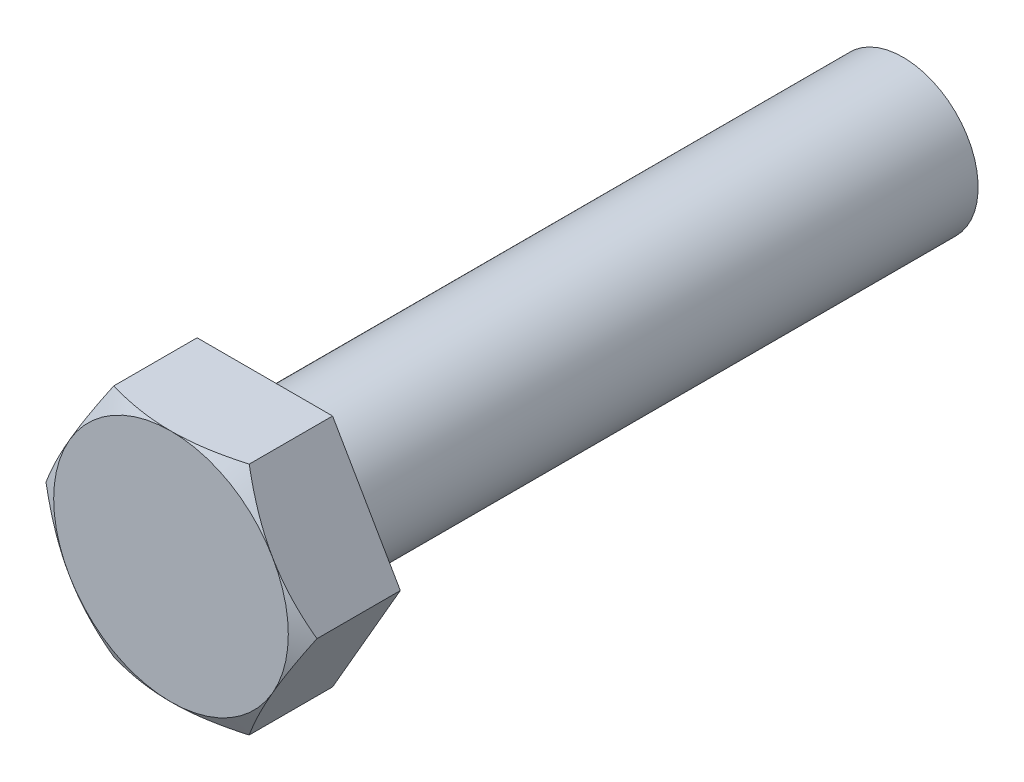
ISO-10303-21;
HEADER;
FILE_DESCRIPTION(('STEP AP214'),'2;1');
FILE_NAME('part.step','',(''),(''),'','','');
FILE_SCHEMA(('AUTOMOTIVE_DESIGN { 1 0 10303 214 1 1 1 1 }'));
ENDSEC;
DATA;
#1=APPLICATION_CONTEXT('core data for automotive mechanical design processes');
#2=APPLICATION_PROTOCOL_DEFINITION('international standard','automotive_design',2000,#1);
#3=PRODUCT_CONTEXT('',#1,'mechanical');
#4=PRODUCT('Part','Part','',(#3));
#5=PRODUCT_RELATED_PRODUCT_CATEGORY('part','',(#4));
#6=PRODUCT_DEFINITION_FORMATION('','',#4);
#7=PRODUCT_DEFINITION_CONTEXT('part definition',#1,'design');
#8=PRODUCT_DEFINITION('design','',#6,#7);
#9=PRODUCT_DEFINITION_SHAPE('','',#8);
#10=(LENGTH_UNIT() NAMED_UNIT(*) SI_UNIT(.MILLI.,.METRE.));
#11=(NAMED_UNIT(*) PLANE_ANGLE_UNIT() SI_UNIT($,.RADIAN.));
#12=(NAMED_UNIT(*) SI_UNIT($,.STERADIAN.) SOLID_ANGLE_UNIT());
#13=UNCERTAINTY_MEASURE_WITH_UNIT(LENGTH_MEASURE(1.E-05),#10,'distance_accuracy_value','');
#14=(GEOMETRIC_REPRESENTATION_CONTEXT(3) GLOBAL_UNCERTAINTY_ASSIGNED_CONTEXT((#13)) GLOBAL_UNIT_ASSIGNED_CONTEXT((#10,
#11,#12)) REPRESENTATION_CONTEXT('',''));
#15=CARTESIAN_POINT('',(0.,0.,0.));
#16=DIRECTION('',(0.,0.,1.));
#17=DIRECTION('',(1.,0.,0.));
#18=AXIS2_PLACEMENT_3D('',#15,#16,#17);
#19=CARTESIAN_POINT('',(7.21687836487047,-12.4999999999999,10.));
#20=DIRECTION('',(-0.866025403784442,0.499999999999995,0.));
#21=DIRECTION('',(-0.499999999999995,-0.866025403784442,0.));
#22=AXIS2_PLACEMENT_3D('',#19,#20,#21);
#23=PLANE('',#22);
#24=CARTESIAN_POINT('',(7.21676289481664,-12.5001999999999,8.88347836407033));
#25=CARTESIAN_POINT('',(7.37538720676169,-12.2254546323954,8.97505452339786));
#26=CARTESIAN_POINT('',(7.5346302388658,-11.9496376100398,9.06247516136614));
#27=CARTESIAN_POINT('',(7.85439324689781,-11.3957918337473,9.22785029648815));
#28=CARTESIAN_POINT('',(8.01491362441963,-11.1177623842294,9.3058016802497));
#29=CARTESIAN_POINT('',(8.33754155397065,-10.5589544183062,9.45119048700353));
#30=CARTESIAN_POINT('',(8.49965192926075,-10.2781710118697,9.518603033399));
#31=CARTESIAN_POINT('',(8.82499915663676,-9.7146530839528,9.64146662159211));
#32=CARTESIAN_POINT('',(8.98823594390972,-9.43191867473171,9.69691834578115));
#33=CARTESIAN_POINT('',(9.31165322870549,-8.87174350541945,9.79350173205532));
#34=CARTESIAN_POINT('',(9.47180971512837,-8.59434433377332,9.83495306623975));
#35=CARTESIAN_POINT('',(9.79285656486179,-8.03827487842509,9.90445793985327));
#36=CARTESIAN_POINT('',(9.95374694223766,-7.75960457036115,9.93251122140473));
#37=CARTESIAN_POINT('',(10.2757979783547,-7.20179581317628,9.97451166013347));
#38=CARTESIAN_POINT('',(10.4369580868775,-6.92265831706135,9.98847557991421));
#39=CARTESIAN_POINT('',(10.7594270802745,-6.36412563663214,10.0019969897623));
#40=CARTESIAN_POINT('',(10.9207359603978,-6.08473046054667,10.0015549249595));
#41=CARTESIAN_POINT('',(11.2223029665878,-5.56240108393915,9.98727051925018));
#42=CARTESIAN_POINT('',(11.362582581157,-5.319429664239,9.97517053237145));
#43=CARTESIAN_POINT('',(11.642819136161,-4.8340457128341,9.9403038103469));
#44=CARTESIAN_POINT('',(11.7827760530676,-4.59163322188117,9.91753632069194));
#45=CARTESIAN_POINT('',(12.0622911922356,-4.10749879935742,9.86173156560461));
#46=CARTESIAN_POINT('',(12.2018489887703,-3.86577760516695,9.82868581800106));
#47=CARTESIAN_POINT('',(12.4803103038966,-3.38346845942574,9.75290433749104));
#48=CARTESIAN_POINT('',(12.6192137773526,-3.14288058605226,9.71016794582642));
#49=CARTESIAN_POINT('',(13.0408630466772,-2.41256262860773,9.56634247770933));
#50=CARTESIAN_POINT('',(13.3223878040513,-1.92494744524722,9.45091239645998));
#51=CARTESIAN_POINT('',(13.8812393974114,-0.956988091656618,9.18893319969106));
#52=CARTESIAN_POINT('',(14.1585733887867,-0.476631527928806,9.04244561244873));
#53=CARTESIAN_POINT('',(14.4338721997945,0.000200000000000119,8.88347836407033));
#54=B_SPLINE_CURVE_WITH_KNOTS('',3,(#24,#25,#26,#27,#28,#29,#30,#31,#32,#33,#34,#35,#36,#37,#38,
#39,#40,#41,#42,#43,#44,#45,#46,#47,#48,#49,#50,#51,#52,#53),.UNSPECIFIED.,.F.,.F.,(4,2,2,2,2,2,
2,2,2,2,2,2,2,2,4),(0.,0.990629746049023,1.98158432430251,2.97484380692451,3.96804660689564,
4.93673469695275,5.90544143098089,6.87299429712455,7.84051726691999,8.68277430917982,
9.52509093301095,10.3681045344909,11.2111754601961,12.9343924021276,14.6542268428617),.UNSPECIFIED.);
#55=CARTESIAN_POINT('',(7.21687836487052,-12.4999999999999,8.88354503153702));
#56=VERTEX_POINT('',#55);
#57=CARTESIAN_POINT('',(10.8253175473055,-6.24999999999994,10.));
#58=VERTEX_POINT('',#57);
#59=EDGE_CURVE('E222',#56,#58,#54,.T.);
#60=ORIENTED_EDGE('',*,*,#59,.F.);
#61=DIRECTION('',(0.,0.,-1.));
#62=VECTOR('',#61,1.);
#63=CARTESIAN_POINT('',(7.21687836487047,-12.4999999999999,10.));
#64=LINE('',#63,#62);
#65=CARTESIAN_POINT('',(7.21687836487047,-12.4999999999999,0.));
#66=VERTEX_POINT('',#65);
#67=EDGE_CURVE('E225',#56,#66,#64,.T.);
#68=ORIENTED_EDGE('',*,*,#67,.T.);
#69=DIRECTION('',(0.499999999999995,0.866025403784442,0.));
#70=VECTOR('',#69,1.);
#71=CARTESIAN_POINT('',(7.21687836487047,-12.4999999999999,0.));
#72=LINE('',#71,#70);
#73=CARTESIAN_POINT('',(14.4337567297407,0.,0.));
#74=VERTEX_POINT('',#73);
#75=EDGE_CURVE('E269',#66,#74,#72,.T.);
#76=ORIENTED_EDGE('',*,*,#75,.T.);
#77=DIRECTION('',(0.,0.,-1.));
#78=VECTOR('',#77,1.);
#79=CARTESIAN_POINT('',(14.4337567297407,0.,10.));
#80=LINE('',#79,#78);
#81=CARTESIAN_POINT('',(14.4337567297407,0.,8.88354503153699));
#82=VERTEX_POINT('',#81);
#83=EDGE_CURVE('E254',#82,#74,#80,.T.);
#84=ORIENTED_EDGE('',*,*,#83,.F.);
#85=EDGE_CURVE('E228',#58,#82,#54,.T.);
#86=ORIENTED_EDGE('',*,*,#85,.F.);
#87=EDGE_LOOP('',(#60,#68,#76,#84,#86));
#88=FACE_BOUND('',#87,.T.);
#89=ADVANCED_FACE('F46',(#88),#23,.F.);
#90=CARTESIAN_POINT('',(14.4337567297407,0.,10.));
#91=DIRECTION('',(-0.866025403784438,-0.500000000000001,0.));
#92=DIRECTION('',(0.500000000000001,-0.866025403784438,0.));
#93=AXIS2_PLACEMENT_3D('',#90,#91,#92);
#94=PLANE('',#93);
#95=CARTESIAN_POINT('',(14.4338721997945,-0.000200000000000009,8.88347836407033));
#96=CARTESIAN_POINT('',(14.2752478878494,0.274545367604498,8.97505452339787));
#97=CARTESIAN_POINT('',(14.1160048557453,0.550362389960128,9.06247516136614));
#98=CARTESIAN_POINT('',(13.7962418477133,1.10420816625264,9.22785029648816));
#99=CARTESIAN_POINT('',(13.6357214701915,1.38223761577056,9.3058016802497));
#100=CARTESIAN_POINT('',(13.3130935406405,1.9410455816937,9.45119048700354));
#101=CARTESIAN_POINT('',(13.1509831653504,2.22182898813021,9.51860303339901));
#102=CARTESIAN_POINT('',(12.8256359379744,2.78534691604711,9.64146662159212));
#103=CARTESIAN_POINT('',(12.6623991507014,3.0680813252682,9.69691834578116));
#104=CARTESIAN_POINT('',(12.3389818659056,3.62825649458046,9.79350173205534));
#105=CARTESIAN_POINT('',(12.1788253794827,3.90565566622659,9.83495306623977));
#106=CARTESIAN_POINT('',(11.8577785297493,4.46172512157481,9.90445793985329));
#107=CARTESIAN_POINT('',(11.6968881523734,4.74039542963875,9.93251122140476));
#108=CARTESIAN_POINT('',(11.3748371162564,5.29820418682362,9.97451166013349));
#109=CARTESIAN_POINT('',(11.2136770077336,5.57734168293855,9.98847557991424));
#110=CARTESIAN_POINT('',(10.8912080143365,6.13587436336776,10.0019969897623));
#111=CARTESIAN_POINT('',(10.7298991342133,6.41526953945323,10.0015549249595));
#112=CARTESIAN_POINT('',(10.4283321280233,6.93759891606076,9.98727051925021));
#113=CARTESIAN_POINT('',(10.288052513454,7.18057033576091,9.97517053237149));
#114=CARTESIAN_POINT('',(10.0078159584501,7.66595428716582,9.94030381034693));
#115=CARTESIAN_POINT('',(9.86785904154349,7.90836677811876,9.91753632069197));
#116=CARTESIAN_POINT('',(9.58834390237543,8.39250120064252,9.86173156560464));
#117=CARTESIAN_POINT('',(9.44878610584072,8.634222394833,9.82868581800109));
#118=CARTESIAN_POINT('',(9.17032479071441,9.11653154057421,9.75290433749107));
#119=CARTESIAN_POINT('',(9.03142131725846,9.3571194139477,9.71016794582644));
#120=CARTESIAN_POINT('',(8.60977204793384,10.0874373713922,9.56634247770936));
#121=CARTESIAN_POINT('',(8.32824729055969,10.5750525547528,9.45091239646));
#122=CARTESIAN_POINT('',(7.76939569719953,11.5430119083434,9.18893319969107));
#123=CARTESIAN_POINT('',(7.49206170582427,12.0233684720712,9.04244561244874));
#124=CARTESIAN_POINT('',(7.21676289481646,12.5002,8.88347836407033));
#125=B_SPLINE_CURVE_WITH_KNOTS('',3,(#95,#96,#97,#98,#99,#100,#101,#102,#103,#104,#105,#106,
#107,#108,#109,#110,#111,#112,#113,#114,#115,#116,#117,#118,#119,#120,#121,#122,#123,#124),
.UNSPECIFIED.,.F.,.F.,(4,2,2,2,2,2,2,2,2,2,2,2,2,2,4),(0.,0.990629746049024,1.98158432430251,
2.97484380692452,3.96804660689564,4.93673469695275,5.90544143098089,6.87299429712455,
7.84051726691999,8.68277430917984,9.52509093301099,10.3681045344909,11.2111754601962,
12.9343924021277,14.6542268428619),.UNSPECIFIED.);
#126=CARTESIAN_POINT('',(10.8253175473055,6.25000000000002,10.));
#127=VERTEX_POINT('',#126);
#128=EDGE_CURVE('E324',#82,#127,#125,.T.);
#129=ORIENTED_EDGE('',*,*,#128,.F.);
#130=ORIENTED_EDGE('',*,*,#83,.T.);
#131=DIRECTION('',(-0.500000000000001,0.866025403784438,0.));
#132=VECTOR('',#131,1.);
#133=CARTESIAN_POINT('',(14.4337567297407,0.,0.));
#134=LINE('',#133,#132);
#135=CARTESIAN_POINT('',(7.2168783648703,12.5,0.));
#136=VERTEX_POINT('',#135);
#137=EDGE_CURVE('E272',#74,#136,#134,.T.);
#138=ORIENTED_EDGE('',*,*,#137,.T.);
#139=DIRECTION('',(0.,0.,-1.));
#140=VECTOR('',#139,1.);
#141=CARTESIAN_POINT('',(7.2168783648703,12.5,10.));
#142=LINE('',#141,#140);
#143=CARTESIAN_POINT('',(7.2168783648703,12.5,8.88354503153699));
#144=VERTEX_POINT('',#143);
#145=EDGE_CURVE('E252',#144,#136,#142,.T.);
#146=ORIENTED_EDGE('',*,*,#145,.F.);
#147=EDGE_CURVE('E123',#127,#144,#125,.T.);
#148=ORIENTED_EDGE('',*,*,#147,.F.);
#149=EDGE_LOOP('',(#129,#130,#138,#146,#148));
#150=FACE_BOUND('',#149,.T.);
#151=ADVANCED_FACE('F212',(#150),#94,.F.);
#152=CARTESIAN_POINT('',(7.2168783648703,12.5,10.));
#153=DIRECTION('',(0.,-1.,0.));
#154=DIRECTION('',(1.,0.,0.));
#155=AXIS2_PLACEMENT_3D('',#152,#153,#154);
#156=PLANE('',#155);
#157=CARTESIAN_POINT('',(24.7765012862916,12.5000000000001,1.19475807249948));
#158=CARTESIAN_POINT('',(24.1998974161355,12.5000000000001,1.49193760563635));
#159=CARTESIAN_POINT('',(23.6224614176852,12.5000000000001,1.78751653949599));
#160=CARTESIAN_POINT('',(22.4655440656552,12.5000000000001,2.37466799576563));
#161=CARTESIAN_POINT('',(21.8860626751502,12.5000000000001,2.66624044537726));
#162=CARTESIAN_POINT('',(20.7237573107279,12.5000000000001,3.24502948512744));
#163=CARTESIAN_POINT('',(20.1409294519221,12.5000000000001,3.53223828714337));
#164=CARTESIAN_POINT('',(18.9723665926529,12.5000000000001,4.10071044815911));
#165=CARTESIAN_POINT('',(18.3866315512319,12.5000000000001,4.38197372310092));
#166=CARTESIAN_POINT('',(17.1805590822531,12.5000000000001,4.95181807525281));
#167=CARTESIAN_POINT('',(16.5600316564392,12.5000000000001,5.23999807506525));
#168=CARTESIAN_POINT('',(15.3142617299647,12.5000000000001,5.80593718785206));
#169=CARTESIAN_POINT('',(14.6890194647899,12.5000000000001,6.08369681719269));
#170=CARTESIAN_POINT('',(13.4331346667719,12.5,6.62560707688613));
#171=CARTESIAN_POINT('',(12.8024959904823,12.5,6.88976661075678));
#172=CARTESIAN_POINT('',(11.5339543928378,12.5,7.40064699112663));
#173=CARTESIAN_POINT('',(10.8960498345445,12.5,7.64736381395509));
#174=CARTESIAN_POINT('',(9.88224330004639,12.5,8.01857253250698));
#175=CARTESIAN_POINT('',(9.50916426045564,12.5,8.15077314541017));
#176=CARTESIAN_POINT('',(8.75985947470989,12.5,8.40602235644371));
#177=CARTESIAN_POINT('',(8.38363362572559,12.5,8.52907065419086));
#178=CARTESIAN_POINT('',(7.627978787236,12.5,8.76436585350295));
#179=CARTESIAN_POINT('',(7.24855122663925,12.5,8.87661732227583));
#180=CARTESIAN_POINT('',(6.48620632118175,12.5,9.08854743269489));
#181=CARTESIAN_POINT('',(6.10328921273989,12.5,9.18822691940887));
#182=CARTESIAN_POINT('',(5.34129401019572,12.5,9.37124831687471));
#183=CARTESIAN_POINT('',(4.96228269562896,12.5,9.454866389797));
#184=CARTESIAN_POINT('',(4.20106525241644,12.5,9.60611195721273));
#185=CARTESIAN_POINT('',(3.81885919897493,12.5,9.67373982702464));
#186=CARTESIAN_POINT('',(3.05186830936368,12.5,9.7910835585697));
#187=CARTESIAN_POINT('',(2.66708479634935,12.5,9.8408079860001));
#188=CARTESIAN_POINT('',(1.89548175923276,12.5,9.92078674021475));
#189=CARTESIAN_POINT('',(1.50866225214794,12.5,9.95104122947475));
#190=CARTESIAN_POINT('',(0.728556470752456,12.5,9.99127986791665));
#191=CARTESIAN_POINT('',(0.335255135567088,12.5,10.0009759725157));
#192=CARTESIAN_POINT('',(-0.451288459851893,12.5,9.99886856253166));
#193=CARTESIAN_POINT('',(-0.844530720116573,12.5,9.98706505929487));
#194=CARTESIAN_POINT('',(-1.62991024995988,12.5,9.94240657939614));
#195=CARTESIAN_POINT('',(-2.02204719425373,12.5,9.90954594734626));
#196=CARTESIAN_POINT('',(-2.80413300088483,12.5,9.82396117825084));
#197=CARTESIAN_POINT('',(-3.19408180782867,12.5,9.77123654062322));
#198=CARTESIAN_POINT('',(-3.97893457640243,12.5,9.6463943629511));
#199=CARTESIAN_POINT('',(-4.37377897327172,12.5,9.57390573183777));
#200=CARTESIAN_POINT('',(-5.16002620638111,12.5,9.41216032701313));
#201=CARTESIAN_POINT('',(-5.55142871158439,12.5,9.32290195848083));
#202=CARTESIAN_POINT('',(-6.33066299355727,12.5,9.12978155748332));
#203=CARTESIAN_POINT('',(-6.71849411024822,12.5,9.02591688093455));
#204=CARTESIAN_POINT('',(-7.49056269946566,12.5,8.80565831121945));
#205=CARTESIAN_POINT('',(-7.87480015322475,12.5,8.68926435266043));
#206=CARTESIAN_POINT('',(-8.62739509474888,12.5,8.44976929220832));
#207=CARTESIAN_POINT('',(-8.99586203928143,12.5,8.32701035168285));
#208=CARTESIAN_POINT('',(-9.729850183168,12.5,8.07296050969923));
#209=CARTESIAN_POINT('',(-10.0953712528418,12.5,7.94166923492069));
#210=CARTESIAN_POINT('',(-10.8237780366845,12.5,7.67178988019852));
#211=CARTESIAN_POINT('',(-11.1866632509072,12.5,7.53320045511288));
#212=CARTESIAN_POINT('',(-11.9100041943345,12.5,7.2498052535557));
#213=CARTESIAN_POINT('',(-12.2704598522449,12.5,7.10499929557371));
#214=CARTESIAN_POINT('',(-12.9895790271643,12.5,6.80990785561051));
#215=CARTESIAN_POINT('',(-13.3482401442574,12.5,6.659616536529));
#216=CARTESIAN_POINT('',(-14.0636090896004,12.5,6.35444926467186));
#217=CARTESIAN_POINT('',(-14.4203168864159,12.5,6.19957323837069));
#218=CARTESIAN_POINT('',(-15.4877451291028,12.5,5.72908229852713));
#219=CARTESIAN_POINT('',(-16.1958656009273,12.5,5.40756506426734));
#220=CARTESIAN_POINT('',(-17.5661632691339,12.4999999999999,4.77147420818949));
#221=CARTESIAN_POINT('',(-18.2286478063124,12.4999999999999,4.45755855893807));
#222=CARTESIAN_POINT('',(-19.5496840184747,12.4999999999999,3.82151499900225));
#223=CARTESIAN_POINT('',(-20.2082355604319,12.4999999999999,3.49938681246325));
#224=CARTESIAN_POINT('',(-21.5199168650249,12.4999999999999,2.84974361849103));
#225=CARTESIAN_POINT('',(-22.1730574086854,12.4999999999999,2.52225033709803));
#226=CARTESIAN_POINT('',(-23.1507729540944,12.4999999999999,2.02714639660616));
#227=CARTESIAN_POINT('',(-23.4763321280193,12.4999999999999,1.86147469892023));
#228=CARTESIAN_POINT('',(-24.1268512135208,12.4999999999999,1.52896249049734));
#229=CARTESIAN_POINT('',(-24.4518111278894,12.4999999999999,1.36212198522307));
#230=CARTESIAN_POINT('',(-24.7765012862916,12.4999999999999,1.19475807249948));
#231=B_SPLINE_CURVE_WITH_KNOTS('',3,(#157,#158,#159,#160,#161,#162,#163,#164,#165,#166,#167,
#168,#169,#170,#171,#172,#173,#174,#175,#176,#177,#178,#179,#180,#181,#182,#183,#184,#185,#186,
#187,#188,#189,#190,#191,#192,#193,#194,#195,#196,#197,#198,#199,#200,#201,#202,#203,#204,#205,
#206,#207,#208,#209,#210,#211,#212,#213,#214,#215,#216,#217,#218,#219,#220,#221,#222,#223,#224,
#225,#226,#227,#228,#229,#230),.UNSPECIFIED.,.F.,.F.,(4,2,2,2,2,2,2,2,2,2,2,2,2,2,2,2,2,2,2,2,2,
2,2,2,2,2,2,2,2,2,2,2,2,2,2,2,4),(0.,1.94605154231722,3.8921383980294,5.84136558409422,
7.79062030997213,9.8430860330885,11.8954499145531,13.9464526376125,15.9979269509764,
17.1852596919713,18.3726313845924,19.5594985729872,20.7462859395682,21.9103603274834,
23.0744073897922,24.2378967847251,25.4013764702661,26.5810528481045,27.7607286033791,
28.9407213212315,30.1207437774327,31.3246620433605,32.5286948612851,33.7329459185648,
34.9372032613623,36.1022178509439,37.2672834484779,38.4325645391846,39.5978796769665,
40.7644732384362,41.9310855188598,44.264001067161,46.4632243873329,48.6625216757795,
50.8544323475098,51.9502967739281,53.0461560819878),.UNSPECIFIED.);
#232=CARTESIAN_POINT('',(0.,12.5,10.));
#233=VERTEX_POINT('',#232);
#234=EDGE_CURVE('E119',#144,#233,#231,.T.);
#235=ORIENTED_EDGE('',*,*,#234,.F.);
#236=ORIENTED_EDGE('',*,*,#145,.T.);
#237=DIRECTION('',(-1.,0.,0.));
#238=VECTOR('',#237,1.);
#239=CARTESIAN_POINT('',(7.2168783648703,12.5,0.));
#240=LINE('',#239,#238);
#241=CARTESIAN_POINT('',(-7.21687836487039,12.5,0.));
#242=VERTEX_POINT('',#241);
#243=EDGE_CURVE('E275',#136,#242,#240,.T.);
#244=ORIENTED_EDGE('',*,*,#243,.T.);
#245=DIRECTION('',(0.,0.,-1.));
#246=VECTOR('',#245,1.);
#247=CARTESIAN_POINT('',(-7.21687836487039,12.5,10.));
#248=LINE('',#247,#246);
#249=CARTESIAN_POINT('',(-7.21687836487039,12.5,8.88354503153699));
#250=VERTEX_POINT('',#249);
#251=EDGE_CURVE('E145',#250,#242,#248,.T.);
#252=ORIENTED_EDGE('',*,*,#251,.F.);
#253=EDGE_CURVE('E128',#233,#250,#231,.T.);
#254=ORIENTED_EDGE('',*,*,#253,.F.);
#255=EDGE_LOOP('',(#235,#236,#244,#252,#254));
#256=FACE_BOUND('',#255,.T.);
#257=ADVANCED_FACE('F143',(#256),#156,.F.);
#258=CARTESIAN_POINT('',(-7.21687836487039,12.5,10.));
#259=DIRECTION('',(0.866025403784442,-0.499999999999995,0.));
#260=DIRECTION('',(0.499999999999995,0.866025403784442,0.));
#261=AXIS2_PLACEMENT_3D('',#258,#259,#260);
#262=PLANE('',#261);
#263=CARTESIAN_POINT('',(-7.21676289481655,12.5002,8.88347836407033));
#264=CARTESIAN_POINT('',(-7.37538720676161,12.2254546323955,8.97505452339786));
#265=CARTESIAN_POINT('',(-7.53463023886571,11.9496376100399,9.06247516136614));
#266=CARTESIAN_POINT('',(-7.85439324689773,11.3957918337473,9.22785029648816));
#267=CARTESIAN_POINT('',(-8.01491362441954,11.1177623842294,9.3058016802497));
#268=CARTESIAN_POINT('',(-8.33754155397057,10.5589544183063,9.45119048700354));
#269=CARTESIAN_POINT('',(-8.49965192926066,10.2781710118698,9.51860303339901));
#270=CARTESIAN_POINT('',(-8.82499915663667,9.71465308395286,9.64146662159212));
#271=CARTESIAN_POINT('',(-8.98823594390963,9.43191867473177,9.69691834578116));
#272=CARTESIAN_POINT('',(-9.3116532287054,8.8717435054195,9.79350173205533));
#273=CARTESIAN_POINT('',(-9.47180971512827,8.59434433377337,9.83495306623977));
#274=CARTESIAN_POINT('',(-9.79285656486169,8.03827487842515,9.90445793985329));
#275=CARTESIAN_POINT('',(-9.95374694223757,7.75960457036121,9.93251122140476));
#276=CARTESIAN_POINT('',(-10.2757979783546,7.20179581317634,9.97451166013349));
#277=CARTESIAN_POINT('',(-10.4369580868775,6.9226583170614,9.98847557991424));
#278=CARTESIAN_POINT('',(-10.7594270802745,6.36412563663219,10.0019969897623));
#279=CARTESIAN_POINT('',(-10.9207359603977,6.08473046054672,10.0015549249595));
#280=CARTESIAN_POINT('',(-11.2223029665877,5.5624010839392,9.98727051925021));
#281=CARTESIAN_POINT('',(-11.3625825811569,5.31942966423905,9.97517053237149));
#282=CARTESIAN_POINT('',(-11.6428191361609,4.83404571283413,9.94030381034693));
#283=CARTESIAN_POINT('',(-11.7827760530675,4.59163322188119,9.91753632069197));
#284=CARTESIAN_POINT('',(-12.0622911922356,4.10749879935743,9.86173156560464));
#285=CARTESIAN_POINT('',(-12.2018489887703,3.86577760516695,9.82868581800109));
#286=CARTESIAN_POINT('',(-12.4803103038966,3.38346845942573,9.75290433749107));
#287=CARTESIAN_POINT('',(-12.6192137773525,3.14288058605224,9.71016794582645));
#288=CARTESIAN_POINT('',(-13.0408630466771,2.4125626286077,9.56634247770936));
#289=CARTESIAN_POINT('',(-13.3223878040513,1.92494744524718,9.45091239646));
#290=CARTESIAN_POINT('',(-13.8812393974114,0.956988091656545,9.18893319969107));
#291=CARTESIAN_POINT('',(-14.1585733887867,0.476631527928721,9.04244561244874));
#292=CARTESIAN_POINT('',(-14.4338721997945,-0.000200000000100462,8.88347836407033));
#293=B_SPLINE_CURVE_WITH_KNOTS('',3,(#263,#264,#265,#266,#267,#268,#269,#270,#271,#272,#273,
#274,#275,#276,#277,#278,#279,#280,#281,#282,#283,#284,#285,#286,#287,#288,#289,#290,#291,#292),
.UNSPECIFIED.,.F.,.F.,(4,2,2,2,2,2,2,2,2,2,2,2,2,2,4),(0.,0.990629746049024,1.98158432430251,
2.97484380692452,3.96804660689564,4.93673469695275,5.9054414309809,6.87299429712455,
7.84051726691999,8.68277430917984,9.52509093301099,10.3681045344909,11.2111754601962,
12.9343924021277,14.6542268428619),.UNSPECIFIED.);
#294=CARTESIAN_POINT('',(-10.8253175473055,6.24999999999994,10.));
#295=VERTEX_POINT('',#294);
#296=EDGE_CURVE('E133',#250,#295,#293,.T.);
#297=ORIENTED_EDGE('',*,*,#296,.F.);
#298=ORIENTED_EDGE('',*,*,#251,.T.);
#299=DIRECTION('',(-0.499999999999995,-0.866025403784442,0.));
#300=VECTOR('',#299,1.);
#301=CARTESIAN_POINT('',(-7.21687836487039,12.5,0.));
#302=LINE('',#301,#300);
#303=CARTESIAN_POINT('',(-14.4337567297407,-1.00790384542582E-13,0.));
#304=VERTEX_POINT('',#303);
#305=EDGE_CURVE('E278',#242,#304,#302,.T.);
#306=ORIENTED_EDGE('',*,*,#305,.T.);
#307=DIRECTION('',(0.,0.,-1.));
#308=VECTOR('',#307,1.);
#309=CARTESIAN_POINT('',(-14.4337567297407,-1.00790384542582E-13,10.));
#310=LINE('',#309,#308);
#311=CARTESIAN_POINT('',(-14.4337567297407,-1.00981524032538E-13,8.88354503153699));
#312=VERTEX_POINT('',#311);
#313=EDGE_CURVE('E242',#312,#304,#310,.T.);
#314=ORIENTED_EDGE('',*,*,#313,.F.);
#315=EDGE_CURVE('E148',#295,#312,#293,.T.);
#316=ORIENTED_EDGE('',*,*,#315,.F.);
#317=EDGE_LOOP('',(#297,#298,#306,#314,#316));
#318=FACE_BOUND('',#317,.T.);
#319=ADVANCED_FACE('F202',(#318),#262,.F.);
#320=CARTESIAN_POINT('',(-14.4337567297407,-1.00790384542582E-13,10.));
#321=DIRECTION('',(0.866025403784435,0.500000000000007,0.));
#322=DIRECTION('',(-0.500000000000007,0.866025403784435,0.));
#323=AXIS2_PLACEMENT_3D('',#320,#321,#322);
#324=PLANE('',#323);
#325=CARTESIAN_POINT('',(-14.4338721997945,0.000199999999899449,8.88347836407033));
#326=CARTESIAN_POINT('',(-14.2752478878494,-0.274545367604597,8.97505452339787));
#327=CARTESIAN_POINT('',(-14.1160048557453,-0.550362389960225,9.06247516136614));
#328=CARTESIAN_POINT('',(-13.7962418477133,-1.10420816625274,9.22785029648816));
#329=CARTESIAN_POINT('',(-13.6357214701915,-1.38223761577066,9.3058016802497));
#330=CARTESIAN_POINT('',(-13.3130935406404,-1.94104558169379,9.45119048700354));
#331=CARTESIAN_POINT('',(-13.1509831653504,-2.2218289881303,9.51860303339901));
#332=CARTESIAN_POINT('',(-12.8256359379743,-2.7853469160472,9.64146662159212));
#333=CARTESIAN_POINT('',(-12.6623991507014,-3.06808132526829,9.69691834578116));
#334=CARTESIAN_POINT('',(-12.3389818659056,-3.62825649458055,9.79350173205534));
#335=CARTESIAN_POINT('',(-12.1788253794827,-3.90565566622668,9.83495306623977));
#336=CARTESIAN_POINT('',(-11.8577785297493,-4.4617251215749,9.90445793985329));
#337=CARTESIAN_POINT('',(-11.6968881523734,-4.74039542963884,9.93251122140476));
#338=CARTESIAN_POINT('',(-11.3748371162564,-5.2982041868237,9.97451166013349));
#339=CARTESIAN_POINT('',(-11.2136770077335,-5.57734168293864,9.98847557991424));
#340=CARTESIAN_POINT('',(-10.8912080143365,-6.13587436336784,10.0019969897623));
#341=CARTESIAN_POINT('',(-10.7298991342133,-6.41526953945331,10.0015549249595));
#342=CARTESIAN_POINT('',(-10.4283321280233,-6.93759891606083,9.98727051925021));
#343=CARTESIAN_POINT('',(-10.288052513454,-7.18057033576098,9.97517053237149));
#344=CARTESIAN_POINT('',(-10.00781595845,-7.66595428716589,9.94030381034693));
#345=CARTESIAN_POINT('',(-9.86785904154343,-7.90836677811882,9.91753632069197));
#346=CARTESIAN_POINT('',(-9.58834390237537,-8.39250120064259,9.86173156560464));
#347=CARTESIAN_POINT('',(-9.44878610584066,-8.63422239483306,9.82868581800109));
#348=CARTESIAN_POINT('',(-9.17032479071434,-9.11653154057428,9.75290433749107));
#349=CARTESIAN_POINT('',(-9.0314213172584,-9.35711941394777,9.71016794582644));
#350=CARTESIAN_POINT('',(-8.60977204793377,-10.0874373713923,9.56634247770936));
#351=CARTESIAN_POINT('',(-8.32824729055962,-10.5750525547528,9.45091239646));
#352=CARTESIAN_POINT('',(-7.76939569719945,-11.5430119083434,9.18893319969107));
#353=CARTESIAN_POINT('',(-7.49206170582418,-12.0233684720713,9.04244561244874));
#354=CARTESIAN_POINT('',(-7.21676289481637,-12.5002000000001,8.88347836407033));
#355=B_SPLINE_CURVE_WITH_KNOTS('',3,(#325,#326,#327,#328,#329,#330,#331,#332,#333,#334,#335,
#336,#337,#338,#339,#340,#341,#342,#343,#344,#345,#346,#347,#348,#349,#350,#351,#352,#353,#354),
.UNSPECIFIED.,.F.,.F.,(4,2,2,2,2,2,2,2,2,2,2,2,2,2,4),(0.,0.990629746049023,1.9815843243025,
2.97484380692451,3.96804660689564,4.93673469695275,5.90544143098089,6.87299429712455,
7.84051726691999,8.68277430917984,9.52509093301099,10.3681045344909,11.2111754601961,
12.9343924021277,14.6542268428618),.UNSPECIFIED.);
#356=CARTESIAN_POINT('',(-10.8253175473054,-6.25000000000009,10.));
#357=VERTEX_POINT('',#356);
#358=EDGE_CURVE('E196',#312,#357,#355,.T.);
#359=ORIENTED_EDGE('',*,*,#358,.F.);
#360=ORIENTED_EDGE('',*,*,#313,.T.);
#361=DIRECTION('',(0.500000000000007,-0.866025403784435,0.));
#362=VECTOR('',#361,1.);
#363=CARTESIAN_POINT('',(-14.4337567297407,-1.00790384542582E-13,0.));
#364=LINE('',#363,#362);
#365=CARTESIAN_POINT('',(-7.21687836487021,-12.5000000000001,0.));
#366=VERTEX_POINT('',#365);
#367=EDGE_CURVE('E244',#304,#366,#364,.T.);
#368=ORIENTED_EDGE('',*,*,#367,.T.);
#369=DIRECTION('',(0.,0.,-1.));
#370=VECTOR('',#369,1.);
#371=CARTESIAN_POINT('',(-7.21687836487021,-12.5000000000001,10.));
#372=LINE('',#371,#370);
#373=CARTESIAN_POINT('',(-7.21687836487021,-12.5000000000001,8.88354503153699));
#374=VERTEX_POINT('',#373);
#375=EDGE_CURVE('E238',#374,#366,#372,.T.);
#376=ORIENTED_EDGE('',*,*,#375,.F.);
#377=EDGE_CURVE('E188',#357,#374,#355,.T.);
#378=ORIENTED_EDGE('',*,*,#377,.F.);
#379=EDGE_LOOP('',(#359,#360,#368,#376,#378));
#380=FACE_BOUND('',#379,.T.);
#381=ADVANCED_FACE('F198',(#380),#324,.F.);
#382=CARTESIAN_POINT('',(-7.21687836487021,-12.5000000000001,10.));
#383=DIRECTION('',(0.,1.,0.));
#384=DIRECTION('',(-1.,0.,0.));
#385=AXIS2_PLACEMENT_3D('',#382,#383,#384);
#386=PLANE('',#385);
#387=CARTESIAN_POINT('',(-24.7765012862915,-12.5000000000003,1.19475807249948));
#388=CARTESIAN_POINT('',(-24.1998974161354,-12.5000000000003,1.49193760563635));
#389=CARTESIAN_POINT('',(-23.6224614176851,-12.5000000000002,1.78751653949599));
#390=CARTESIAN_POINT('',(-22.4655440656551,-12.5000000000002,2.37466799576563));
#391=CARTESIAN_POINT('',(-21.8860626751501,-12.5000000000002,2.66624044537726));
#392=CARTESIAN_POINT('',(-20.7237573107278,-12.5000000000002,3.24502948512744));
#393=CARTESIAN_POINT('',(-20.1409294519221,-12.5000000000002,3.53223828714337));
#394=CARTESIAN_POINT('',(-18.9723665926528,-12.5000000000002,4.10071044815911));
#395=CARTESIAN_POINT('',(-18.3866315512318,-12.5000000000002,4.38197372310091));
#396=CARTESIAN_POINT('',(-17.180559082253,-12.5000000000002,4.9518180752528));
#397=CARTESIAN_POINT('',(-16.5600316564392,-12.5000000000002,5.23999807506525));
#398=CARTESIAN_POINT('',(-15.3142617299646,-12.5000000000002,5.80593718785206));
#399=CARTESIAN_POINT('',(-14.6890194647898,-12.5000000000002,6.08369681719269));
#400=CARTESIAN_POINT('',(-13.4331346667718,-12.5000000000001,6.62560707688613));
#401=CARTESIAN_POINT('',(-12.8024959904822,-12.5000000000001,6.88976661075678));
#402=CARTESIAN_POINT('',(-11.5339543928377,-12.5000000000001,7.40064699112663));
#403=CARTESIAN_POINT('',(-10.8960498345444,-12.5000000000001,7.64736381395509));
#404=CARTESIAN_POINT('',(-9.88224330004631,-12.5000000000001,8.01857253250698));
#405=CARTESIAN_POINT('',(-9.50916426045555,-12.5000000000001,8.15077314541017));
#406=CARTESIAN_POINT('',(-8.75985947470981,-12.5000000000001,8.40602235644371));
#407=CARTESIAN_POINT('',(-8.38363362572551,-12.5000000000001,8.52907065419086));
#408=CARTESIAN_POINT('',(-7.62797878723592,-12.5000000000001,8.76436585350294));
#409=CARTESIAN_POINT('',(-7.24855122663916,-12.5000000000001,8.87661732227583));
#410=CARTESIAN_POINT('',(-6.48620632118167,-12.5000000000001,9.08854743269489));
#411=CARTESIAN_POINT('',(-6.10328921273981,-12.5000000000001,9.18822691940887));
#412=CARTESIAN_POINT('',(-5.34129401019564,-12.5000000000001,9.37124831687471));
#413=CARTESIAN_POINT('',(-4.96228269562887,-12.5000000000001,9.454866389797));
#414=CARTESIAN_POINT('',(-4.20106525241635,-12.5,9.60611195721273));
#415=CARTESIAN_POINT('',(-3.81885919897485,-12.5,9.67373982702464));
#416=CARTESIAN_POINT('',(-3.0518683093636,-12.5,9.7910835585697));
#417=CARTESIAN_POINT('',(-2.66708479634927,-12.5,9.8408079860001));
#418=CARTESIAN_POINT('',(-1.89548175923268,-12.5,9.92078674021475));
#419=CARTESIAN_POINT('',(-1.50866225214786,-12.5,9.95104122947475));
#420=CARTESIAN_POINT('',(-0.728556470752371,-12.5,9.99127986791665));
#421=CARTESIAN_POINT('',(-0.335255135567004,-12.5,10.0009759725157));
#422=CARTESIAN_POINT('',(0.451288459851976,-12.5,9.99886856253166));
#423=CARTESIAN_POINT('',(0.844530720116656,-12.5,9.98706505929486));
#424=CARTESIAN_POINT('',(1.62991024995996,-12.5,9.94240657939614));
#425=CARTESIAN_POINT('',(2.02204719425381,-12.5,9.90954594734626));
#426=CARTESIAN_POINT('',(2.80413300088492,-12.5,9.82396117825084));
#427=CARTESIAN_POINT('',(3.19408180782875,-12.5,9.77123654062322));
#428=CARTESIAN_POINT('',(3.97893457640251,-12.5,9.6463943629511));
#429=CARTESIAN_POINT('',(4.37377897327181,-12.5,9.57390573183777));
#430=CARTESIAN_POINT('',(5.16002620638119,-12.5,9.41216032701313));
#431=CARTESIAN_POINT('',(5.55142871158448,-12.4999999999999,9.32290195848083));
#432=CARTESIAN_POINT('',(6.33066299355735,-12.4999999999999,9.12978155748332));
#433=CARTESIAN_POINT('',(6.71849411024831,-12.4999999999999,9.02591688093455));
#434=CARTESIAN_POINT('',(7.49056269946574,-12.4999999999999,8.80565831121945));
#435=CARTESIAN_POINT('',(7.87480015322483,-12.4999999999999,8.68926435266043));
#436=CARTESIAN_POINT('',(8.62739509474896,-12.4999999999999,8.44976929220832));
#437=CARTESIAN_POINT('',(8.99586203928152,-12.4999999999999,8.32701035168285));
#438=CARTESIAN_POINT('',(9.72985018316808,-12.4999999999999,8.07296050969923));
#439=CARTESIAN_POINT('',(10.0953712528419,-12.4999999999999,7.9416692349207));
#440=CARTESIAN_POINT('',(10.8237780366846,-12.4999999999999,7.67178988019852));
#441=CARTESIAN_POINT('',(11.1866632509073,-12.4999999999999,7.53320045511288));
#442=CARTESIAN_POINT('',(11.9100041943346,-12.4999999999999,7.2498052535557));
#443=CARTESIAN_POINT('',(12.270459852245,-12.4999999999999,7.10499929557371));
#444=CARTESIAN_POINT('',(12.9895790271643,-12.4999999999999,6.80990785561051));
#445=CARTESIAN_POINT('',(13.3482401442574,-12.4999999999999,6.659616536529));
#446=CARTESIAN_POINT('',(14.0636090896005,-12.4999999999999,6.35444926467186));
#447=CARTESIAN_POINT('',(14.420316886416,-12.4999999999999,6.1995732383707));
#448=CARTESIAN_POINT('',(15.4877451291029,-12.4999999999998,5.72908229852713));
#449=CARTESIAN_POINT('',(16.1958656009274,-12.4999999999998,5.40756506426735));
#450=CARTESIAN_POINT('',(17.566163269134,-12.4999999999998,4.77147420818949));
#451=CARTESIAN_POINT('',(18.2286478063125,-12.4999999999998,4.45755855893808));
#452=CARTESIAN_POINT('',(19.5496840184748,-12.4999999999998,3.82151499900225));
#453=CARTESIAN_POINT('',(20.208235560432,-12.4999999999998,3.49938681246325));
#454=CARTESIAN_POINT('',(21.5199168650249,-12.4999999999998,2.84974361849103));
#455=CARTESIAN_POINT('',(22.1730574086855,-12.4999999999998,2.52225033709803));
#456=CARTESIAN_POINT('',(23.1507729540945,-12.4999999999998,2.02714639660616));
#457=CARTESIAN_POINT('',(23.4763321280193,-12.4999999999998,1.86147469892023));
#458=CARTESIAN_POINT('',(24.1268512135209,-12.4999999999998,1.52896249049733));
#459=CARTESIAN_POINT('',(24.4518111278895,-12.4999999999997,1.36212198522306));
#460=CARTESIAN_POINT('',(24.7765012862917,-12.4999999999997,1.19475807249947));
#461=B_SPLINE_CURVE_WITH_KNOTS('',3,(#387,#388,#389,#390,#391,#392,#393,#394,#395,#396,#397,
#398,#399,#400,#401,#402,#403,#404,#405,#406,#407,#408,#409,#410,#411,#412,#413,#414,#415,#416,
#417,#418,#419,#420,#421,#422,#423,#424,#425,#426,#427,#428,#429,#430,#431,#432,#433,#434,#435,
#436,#437,#438,#439,#440,#441,#442,#443,#444,#445,#446,#447,#448,#449,#450,#451,#452,#453,#454,
#455,#456,#457,#458,#459,#460),.UNSPECIFIED.,.F.,.F.,(4,2,2,2,2,2,2,2,2,2,2,2,2,2,2,2,2,2,2,2,2,
2,2,2,2,2,2,2,2,2,2,2,2,2,2,2,4),(0.,1.94605154231721,3.89213839802939,5.84136558409422,
7.79062030997213,9.8430860330885,11.8954499145531,13.9464526376125,15.9979269509764,
17.1852596919713,18.3726313845924,19.5594985729872,20.7462859395682,21.9103603274834,
23.0744073897922,24.2378967847251,25.4013764702661,26.5810528481045,27.7607286033791,
28.9407213212315,30.1207437774327,31.3246620433605,32.5286948612851,33.7329459185648,
34.9372032613623,36.1022178509439,37.2672834484779,38.4325645391846,39.5978796769665,
40.7644732384362,41.9310855188598,44.264001067161,46.4632243873329,48.6625216757795,
50.8544323475098,51.9502967739281,53.0461560819879),.UNSPECIFIED.);
#462=CARTESIAN_POINT('',(1.29199055491395E-13,-12.5,10.));
#463=VERTEX_POINT('',#462);
#464=EDGE_CURVE('E197',#374,#463,#461,.T.);
#465=ORIENTED_EDGE('',*,*,#464,.F.);
#466=ORIENTED_EDGE('',*,*,#375,.T.);
#467=DIRECTION('',(1.,0.,0.));
#468=VECTOR('',#467,1.);
#469=CARTESIAN_POINT('',(-7.21687836487021,-12.5000000000001,0.));
#470=LINE('',#469,#468);
#471=EDGE_CURVE('E235',#366,#66,#470,.T.);
#472=ORIENTED_EDGE('',*,*,#471,.T.);
#473=ORIENTED_EDGE('',*,*,#67,.F.);
#474=EDGE_CURVE('E140',#463,#56,#461,.T.);
#475=ORIENTED_EDGE('',*,*,#474,.F.);
#476=EDGE_LOOP('',(#465,#466,#472,#473,#475));
#477=FACE_BOUND('',#476,.T.);
#478=ADVANCED_FACE('F201',(#477),#386,.F.);
#479=CARTESIAN_POINT('',(0.,0.,0.));
#480=DIRECTION('',(0.,0.,1.));
#481=DIRECTION('',(1.,0.,0.));
#482=AXIS2_PLACEMENT_3D('',#479,#480,#481);
#483=PLANE('',#482);
#484=CARTESIAN_POINT('',(0.,0.,0.));
#485=DIRECTION('',(0.,0.,-1.));
#486=DIRECTION('',(-1.,0.,0.));
#487=AXIS2_PLACEMENT_3D('',#484,#485,#486);
#488=CIRCLE('',#487,8.);
#489=CARTESIAN_POINT('',(-8.,0.,0.));
#490=VERTEX_POINT('',#489);
#491=EDGE_CURVE('E256',#490,#490,#488,.T.);
#492=ORIENTED_EDGE('',*,*,#491,.F.);
#493=EDGE_LOOP('',(#492));
#494=FACE_BOUND('',#493,.T.);
#495=ORIENTED_EDGE('',*,*,#75,.F.);
#496=ORIENTED_EDGE('',*,*,#471,.F.);
#497=ORIENTED_EDGE('',*,*,#367,.F.);
#498=ORIENTED_EDGE('',*,*,#305,.F.);
#499=ORIENTED_EDGE('',*,*,#243,.F.);
#500=ORIENTED_EDGE('',*,*,#137,.F.);
#501=EDGE_LOOP('',(#495,#496,#497,#498,#499,#500));
#502=FACE_BOUND('',#501,.T.);
#503=ADVANCED_FACE('F290',(#494,#502),#483,.F.);
#504=CARTESIAN_POINT('',(0.,0.,-68.));
#505=DIRECTION('',(0.,0.,1.));
#506=DIRECTION('',(1.,0.,0.));
#507=AXIS2_PLACEMENT_3D('',#504,#505,#506);
#508=CYLINDRICAL_SURFACE('',#507,8.);
#509=CARTESIAN_POINT('',(0.,0.,-68.));
#510=DIRECTION('',(0.,0.,-1.));
#511=DIRECTION('',(-1.,0.,0.));
#512=AXIS2_PLACEMENT_3D('',#509,#510,#511);
#513=CIRCLE('',#512,8.);
#514=CARTESIAN_POINT('',(-8.,0.,-68.));
#515=VERTEX_POINT('',#514);
#516=EDGE_CURVE('E230',#515,#515,#513,.T.);
#517=ORIENTED_EDGE('',*,*,#516,.F.);
#518=EDGE_LOOP('',(#517));
#519=FACE_BOUND('',#518,.T.);
#520=ORIENTED_EDGE('',*,*,#491,.T.);
#521=EDGE_LOOP('',(#520));
#522=FACE_BOUND('',#521,.T.);
#523=ADVANCED_FACE('F322',(#519,#522),#508,.T.);
#524=CARTESIAN_POINT('',(0.,0.,-68.));
#525=DIRECTION('',(0.,0.,-1.));
#526=DIRECTION('',(-1.,0.,0.));
#527=AXIS2_PLACEMENT_3D('',#524,#525,#526);
#528=PLANE('',#527);
#529=ORIENTED_EDGE('',*,*,#516,.T.);
#530=EDGE_LOOP('',(#529));
#531=FACE_BOUND('',#530,.T.);
#532=ADVANCED_FACE('F176',(#531),#528,.T.);
#533=CARTESIAN_POINT('',(0.,0.,10.));
#534=DIRECTION('',(0.,0.,-1.));
#535=DIRECTION('',(1.,0.,0.));
#536=AXIS2_PLACEMENT_3D('',#533,#534,#535);
#537=CONICAL_SURFACE('',#536,12.5,1.0471975511966);
#538=ORIENTED_EDGE('',*,*,#85,.T.);
#539=ORIENTED_EDGE('',*,*,#128,.T.);
#540=CARTESIAN_POINT('',(0.,0.,10.));
#541=DIRECTION('',(0.,0.,1.));
#542=DIRECTION('',(1.,0.,0.));
#543=AXIS2_PLACEMENT_3D('',#540,#541,#542);
#544=CIRCLE('',#543,12.5);
#545=EDGE_CURVE('E50',#58,#127,#544,.T.);
#546=ORIENTED_EDGE('',*,*,#545,.F.);
#547=EDGE_LOOP('',(#538,#539,#546));
#548=FACE_BOUND('',#547,.T.);
#549=ADVANCED_FACE('F174',(#548),#537,.T.);
#550=ORIENTED_EDGE('',*,*,#59,.T.);
#551=EDGE_CURVE('E266',#463,#58,#544,.T.);
#552=ORIENTED_EDGE('',*,*,#551,.F.);
#553=ORIENTED_EDGE('',*,*,#474,.T.);
#554=EDGE_LOOP('',(#550,#552,#553));
#555=FACE_BOUND('',#554,.T.);
#556=ADVANCED_FACE('F169',(#555),#537,.T.);
#557=ORIENTED_EDGE('',*,*,#377,.T.);
#558=ORIENTED_EDGE('',*,*,#464,.T.);
#559=EDGE_CURVE('E71',#357,#463,#544,.T.);
#560=ORIENTED_EDGE('',*,*,#559,.F.);
#561=EDGE_LOOP('',(#557,#558,#560));
#562=FACE_BOUND('',#561,.T.);
#563=ADVANCED_FACE('F173',(#562),#537,.T.);
#564=ORIENTED_EDGE('',*,*,#315,.T.);
#565=ORIENTED_EDGE('',*,*,#358,.T.);
#566=EDGE_CURVE('E56',#295,#357,#544,.T.);
#567=ORIENTED_EDGE('',*,*,#566,.F.);
#568=EDGE_LOOP('',(#564,#565,#567));
#569=FACE_BOUND('',#568,.T.);
#570=ADVANCED_FACE('F295',(#569),#537,.T.);
#571=ORIENTED_EDGE('',*,*,#253,.T.);
#572=ORIENTED_EDGE('',*,*,#296,.T.);
#573=EDGE_CURVE('E12',#233,#295,#544,.T.);
#574=ORIENTED_EDGE('',*,*,#573,.F.);
#575=EDGE_LOOP('',(#571,#572,#574));
#576=FACE_BOUND('',#575,.T.);
#577=ADVANCED_FACE('F131',(#576),#537,.T.);
#578=ORIENTED_EDGE('',*,*,#147,.T.);
#579=ORIENTED_EDGE('',*,*,#234,.T.);
#580=CARTESIAN_POINT('',(0.,0.,10.));
#581=DIRECTION('',(0.,0.,1.));
#582=DIRECTION('',(1.,0.,0.));
#583=AXIS2_PLACEMENT_3D('',#580,#581,#582);
#584=CIRCLE('',#583,12.5);
#585=EDGE_CURVE('E63',#127,#233,#584,.T.);
#586=ORIENTED_EDGE('',*,*,#585,.F.);
#587=EDGE_LOOP('',(#578,#579,#586));
#588=FACE_BOUND('',#587,.T.);
#589=ADVANCED_FACE('F121',(#588),#537,.T.);
#590=CARTESIAN_POINT('',(0.,0.,10.));
#591=DIRECTION('',(0.,0.,1.));
#592=DIRECTION('',(1.,0.,0.));
#593=AXIS2_PLACEMENT_3D('',#590,#591,#592);
#594=PLANE('',#593);
#595=ORIENTED_EDGE('',*,*,#545,.T.);
#596=ORIENTED_EDGE('',*,*,#585,.T.);
#597=ORIENTED_EDGE('',*,*,#573,.T.);
#598=ORIENTED_EDGE('',*,*,#566,.T.);
#599=ORIENTED_EDGE('',*,*,#559,.T.);
#600=ORIENTED_EDGE('',*,*,#551,.T.);
#601=EDGE_LOOP('',(#595,#596,#597,#598,#599,#600));
#602=FACE_BOUND('',#601,.T.);
#603=ADVANCED_FACE('F137',(#602),#594,.T.);
#604=CLOSED_SHELL('',(#89,#151,#257,#319,#381,#478,#503,#523,#532,#549,#556,#563,#570,#577,#589,#603));
#605=MANIFOLD_SOLID_BREP('B2',#604);
#606=ADVANCED_BREP_SHAPE_REPRESENTATION('',(#18,#605),#14);
#607=SHAPE_DEFINITION_REPRESENTATION(#9,#606);
ENDSEC;
END-ISO-10303-21;
